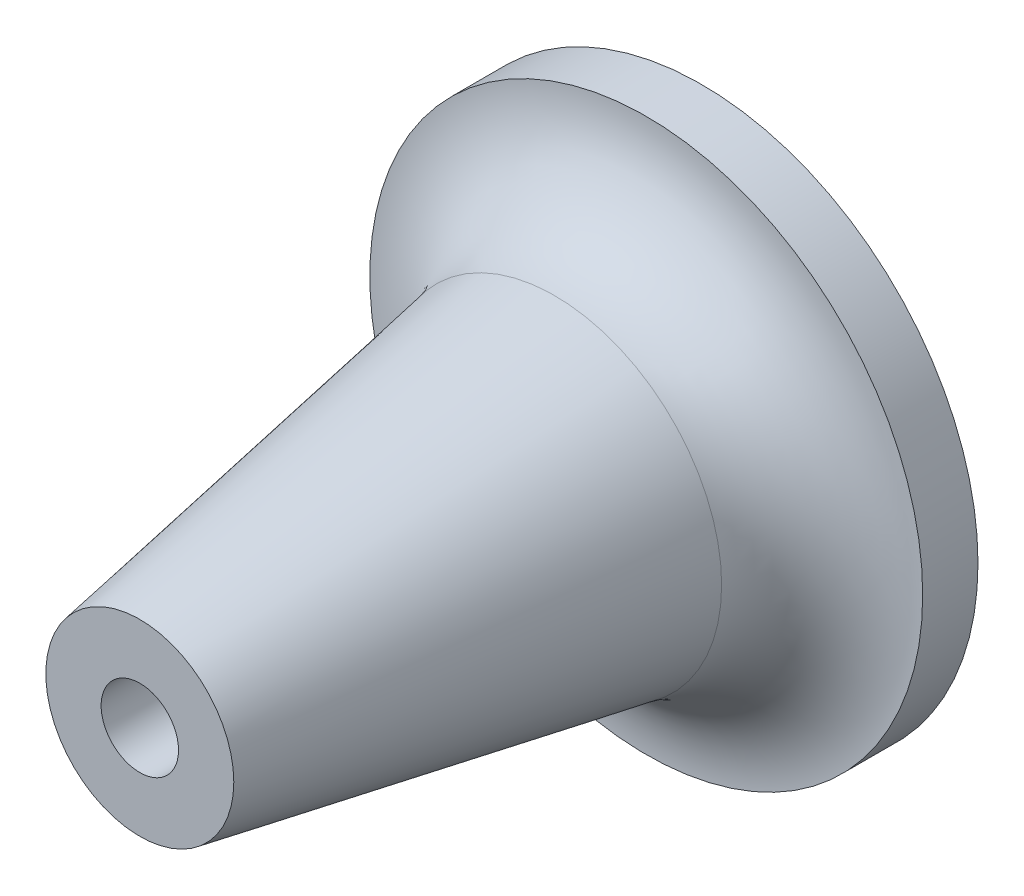
ISO-10303-21;
HEADER;
FILE_DESCRIPTION(('STEP AP214'),'2;1');
FILE_NAME('part.step','',(''),(''),'','','');
FILE_SCHEMA(('AUTOMOTIVE_DESIGN { 1 0 10303 214 1 1 1 1 }'));
ENDSEC;
DATA;
#1=APPLICATION_CONTEXT('core data for automotive mechanical design processes');
#2=APPLICATION_PROTOCOL_DEFINITION('international standard','automotive_design',2000,#1);
#3=PRODUCT_CONTEXT('',#1,'mechanical');
#4=PRODUCT('Part','Part','',(#3));
#5=PRODUCT_RELATED_PRODUCT_CATEGORY('part','',(#4));
#6=PRODUCT_DEFINITION_FORMATION('','',#4);
#7=PRODUCT_DEFINITION_CONTEXT('part definition',#1,'design');
#8=PRODUCT_DEFINITION('design','',#6,#7);
#9=PRODUCT_DEFINITION_SHAPE('','',#8);
#10=(LENGTH_UNIT() NAMED_UNIT(*) SI_UNIT(.MILLI.,.METRE.));
#11=(NAMED_UNIT(*) PLANE_ANGLE_UNIT() SI_UNIT($,.RADIAN.));
#12=(NAMED_UNIT(*) SI_UNIT($,.STERADIAN.) SOLID_ANGLE_UNIT());
#13=UNCERTAINTY_MEASURE_WITH_UNIT(LENGTH_MEASURE(1.E-05),#10,'distance_accuracy_value','');
#14=(GEOMETRIC_REPRESENTATION_CONTEXT(3) GLOBAL_UNCERTAINTY_ASSIGNED_CONTEXT((#13)) GLOBAL_UNIT_ASSIGNED_CONTEXT((#10,
#11,#12)) REPRESENTATION_CONTEXT('',''));
#15=CARTESIAN_POINT('',(0.,0.,0.));
#16=DIRECTION('',(0.,0.,1.));
#17=DIRECTION('',(1.,0.,0.));
#18=AXIS2_PLACEMENT_3D('',#15,#16,#17);
#19=CARTESIAN_POINT('',(0.,8.5,33.7153604632454));
#20=DIRECTION('',(0.,0.,-1.));
#21=DIRECTION('',(-1.,0.,0.));
#22=AXIS2_PLACEMENT_3D('',#19,#20,#21);
#23=PLANE('',#22);
#24=CARTESIAN_POINT('',(0.,0.,33.7153604632454));
#25=DIRECTION('',(0.,0.,1.));
#26=DIRECTION('',(1.,0.,0.));
#27=AXIS2_PLACEMENT_3D('',#24,#25,#26);
#28=CIRCLE('',#27,3.5);
#29=CARTESIAN_POINT('',(3.5,0.,33.7153604632454));
#30=VERTEX_POINT('',#29);
#31=EDGE_CURVE('E10',#30,#30,#28,.T.);
#32=ORIENTED_EDGE('',*,*,#31,.F.);
#33=EDGE_LOOP('',(#32));
#34=FACE_BOUND('',#33,.T.);
#35=CARTESIAN_POINT('',(0.,0.,33.7153604632454));
#36=DIRECTION('',(0.,0.,1.));
#37=DIRECTION('',(1.,0.,0.));
#38=AXIS2_PLACEMENT_3D('',#35,#36,#37);
#39=CIRCLE('',#38,8.5);
#40=CARTESIAN_POINT('',(8.5,0.,33.7153604632454));
#41=VERTEX_POINT('',#40);
#42=EDGE_CURVE('E59',#41,#41,#39,.T.);
#43=ORIENTED_EDGE('',*,*,#42,.T.);
#44=EDGE_LOOP('',(#43));
#45=FACE_BOUND('',#44,.T.);
#46=ADVANCED_FACE('F31',(#34,#45),#23,.F.);
#47=CARTESIAN_POINT('',(0.,0.,51.4954979569622));
#48=DIRECTION('',(0.,0.,1.));
#49=DIRECTION('',(1.,0.,0.));
#50=AXIS2_PLACEMENT_3D('',#47,#48,#49);
#51=CYLINDRICAL_SURFACE('',#50,3.5);
#52=CARTESIAN_POINT('',(0.,0.,28.7153604632454));
#53=DIRECTION('',(0.,0.,1.));
#54=DIRECTION('',(1.,0.,0.));
#55=AXIS2_PLACEMENT_3D('',#52,#53,#54);
#56=CIRCLE('',#55,3.5);
#57=CARTESIAN_POINT('',(-3.5,0.,28.7153604632454));
#58=VERTEX_POINT('',#57);
#59=EDGE_CURVE('E37',#58,#58,#56,.T.);
#60=ORIENTED_EDGE('',*,*,#59,.F.);
#61=EDGE_LOOP('',(#60));
#62=FACE_BOUND('',#61,.T.);
#63=ORIENTED_EDGE('',*,*,#31,.T.);
#64=EDGE_LOOP('',(#63));
#65=FACE_BOUND('',#64,.T.);
#66=ADVANCED_FACE('F96',(#62,#65),#51,.F.);
#67=CARTESIAN_POINT('',(0.,0.,28.7153604632454));
#68=DIRECTION('',(0.,0.,-1.));
#69=DIRECTION('',(-1.,0.,0.));
#70=AXIS2_PLACEMENT_3D('',#67,#68,#69);
#71=CONICAL_SURFACE('',#70,3.5,0.191026219231218);
#72=CARTESIAN_POINT('',(0.,0.,-10.5846395367546));
#73=DIRECTION('',(0.,0.,1.));
#74=DIRECTION('',(1.,0.,0.));
#75=AXIS2_PLACEMENT_3D('',#72,#73,#74);
#76=CIRCLE('',#75,11.1);
#77=CARTESIAN_POINT('',(-11.1,0.,-10.5846395367546));
#78=VERTEX_POINT('',#77);
#79=EDGE_CURVE('E41',#78,#78,#76,.T.);
#80=CARTESIAN_POINT('',(-11.1,0.,-10.5846395367546));
#81=CARTESIAN_POINT('',(-11.0208333333333,0.,-10.1752645367546));
#82=CARTESIAN_POINT('',(-10.9416666666667,0.,-9.76588953675459));
#83=CARTESIAN_POINT('',(-10.7833333333333,0.,-8.94713953675459));
#84=CARTESIAN_POINT('',(-10.7041666666667,0.,-8.53776453675459));
#85=CARTESIAN_POINT('',(-10.5458333333333,0.,-7.71901453675459));
#86=CARTESIAN_POINT('',(-10.4666666666667,0.,-7.30963953675459));
#87=CARTESIAN_POINT('',(-10.3083333333333,0.,-6.49088953675459));
#88=CARTESIAN_POINT('',(-10.2291666666667,0.,-6.08151453675459));
#89=CARTESIAN_POINT('',(-10.0708333333333,0.,-5.26276453675459));
#90=CARTESIAN_POINT('',(-9.99166666666667,0.,-4.85338953675459));
#91=CARTESIAN_POINT('',(-9.83333333333334,0.,-4.03463953675459));
#92=CARTESIAN_POINT('',(-9.75416666666667,0.,-3.62526453675459));
#93=CARTESIAN_POINT('',(-9.59583333333334,0.,-2.80651453675459));
#94=CARTESIAN_POINT('',(-9.51666666666667,0.,-2.39713953675459));
#95=CARTESIAN_POINT('',(-9.35833333333333,0.,-1.57838953675459));
#96=CARTESIAN_POINT('',(-9.27916666666667,0.,-1.16901453675459));
#97=CARTESIAN_POINT('',(-9.12083333333334,0.,-0.350264536754592));
#98=CARTESIAN_POINT('',(-9.04166666666667,0.,0.0591104632454085));
#99=CARTESIAN_POINT('',(-8.88333333333333,0.,0.877860463245408));
#100=CARTESIAN_POINT('',(-8.80416666666667,0.,1.28723546324541));
#101=CARTESIAN_POINT('',(-8.64583333333334,0.,2.10598546324541));
#102=CARTESIAN_POINT('',(-8.56666666666667,0.,2.51536046324541));
#103=CARTESIAN_POINT('',(-8.40833333333333,0.,3.33411046324541));
#104=CARTESIAN_POINT('',(-8.32916666666667,0.,3.74348546324541));
#105=CARTESIAN_POINT('',(-8.17083333333333,0.,4.56223546324541));
#106=CARTESIAN_POINT('',(-8.09166666666667,0.,4.97161046324541));
#107=CARTESIAN_POINT('',(-7.93333333333334,0.,5.79036046324541));
#108=CARTESIAN_POINT('',(-7.85416666666667,0.,6.19973546324541));
#109=CARTESIAN_POINT('',(-7.69583333333333,0.,7.01848546324541));
#110=CARTESIAN_POINT('',(-7.61666666666667,0.,7.42786046324541));
#111=CARTESIAN_POINT('',(-7.45833333333333,0.,8.24661046324541));
#112=CARTESIAN_POINT('',(-7.37916666666667,0.,8.65598546324541));
#113=CARTESIAN_POINT('',(-7.22083333333333,0.,9.47473546324541));
#114=CARTESIAN_POINT('',(-7.14166666666667,0.,9.88411046324541));
#115=CARTESIAN_POINT('',(-6.98333333333333,0.,10.7028604632454));
#116=CARTESIAN_POINT('',(-6.90416666666667,0.,11.1122354632454));
#117=CARTESIAN_POINT('',(-6.74583333333333,0.,11.9309854632454));
#118=CARTESIAN_POINT('',(-6.66666666666667,0.,12.3403604632454));
#119=CARTESIAN_POINT('',(-6.50833333333333,0.,13.1591104632454));
#120=CARTESIAN_POINT('',(-6.42916666666667,0.,13.5684854632454));
#121=CARTESIAN_POINT('',(-6.27083333333333,0.,14.3872354632454));
#122=CARTESIAN_POINT('',(-6.19166666666667,0.,14.7966104632454));
#123=CARTESIAN_POINT('',(-6.03333333333333,0.,15.6153604632454));
#124=CARTESIAN_POINT('',(-5.95416666666667,0.,16.0247354632454));
#125=CARTESIAN_POINT('',(-5.79583333333333,0.,16.8434854632454));
#126=CARTESIAN_POINT('',(-5.71666666666667,0.,17.2528604632454));
#127=CARTESIAN_POINT('',(-5.55833333333333,0.,18.0716104632454));
#128=CARTESIAN_POINT('',(-5.47916666666667,0.,18.4809854632454));
#129=CARTESIAN_POINT('',(-5.32083333333333,0.,19.2997354632454));
#130=CARTESIAN_POINT('',(-5.24166666666667,0.,19.7091104632454));
#131=CARTESIAN_POINT('',(-5.08333333333333,0.,20.5278604632454));
#132=CARTESIAN_POINT('',(-5.00416666666667,0.,20.9372354632454));
#133=CARTESIAN_POINT('',(-4.84583333333333,0.,21.7559854632454));
#134=CARTESIAN_POINT('',(-4.76666666666667,0.,22.1653604632454));
#135=CARTESIAN_POINT('',(-4.60833333333333,0.,22.9841104632454));
#136=CARTESIAN_POINT('',(-4.52916666666667,0.,23.3934854632454));
#137=CARTESIAN_POINT('',(-4.37083333333333,0.,24.2122354632454));
#138=CARTESIAN_POINT('',(-4.29166666666667,0.,24.6216104632454));
#139=CARTESIAN_POINT('',(-4.13333333333333,0.,25.4403604632454));
#140=CARTESIAN_POINT('',(-4.05416666666667,0.,25.8497354632454));
#141=CARTESIAN_POINT('',(-3.89583333333333,0.,26.6684854632454));
#142=CARTESIAN_POINT('',(-3.81666666666667,0.,27.0778604632454));
#143=CARTESIAN_POINT('',(-3.65833333333333,0.,27.8966104632454));
#144=CARTESIAN_POINT('',(-3.57916666666667,0.,28.3059854632454));
#145=CARTESIAN_POINT('',(-3.5,0.,28.7153604632454));
#146=B_SPLINE_CURVE_WITH_KNOTS('',3,(#80,#81,#82,#83,#84,#85,#86,#87,#88,#89,#90,#91,#92,#93,
#94,#95,#96,#97,#98,#99,#100,#101,#102,#103,#104,#105,#106,#107,#108,#109,#110,#111,#112,#113,
#114,#115,#116,#117,#118,#119,#120,#121,#122,#123,#124,#125,#126,#127,#128,#129,#130,#131,#132,
#133,#134,#135,#136,#137,#138,#139,#140,#141,#142,#143,#144,#145),.UNSPECIFIED.,.F.,.F.,(4,2,2,
2,2,2,2,2,2,2,2,2,2,2,2,2,2,2,2,2,2,2,2,2,2,2,2,2,2,2,2,2,4),(0.,1.25087859747659,
2.50175719495318,3.75263579242977,5.00351438990636,6.25439298738295,7.50527158485954,
8.75615018233613,10.0070287798127,11.2579073772893,12.5087859747659,13.7596645722425,
15.0105431697191,16.2614217671957,17.5123003646723,18.7631789621488,20.0140575596254,
21.264936157102,22.5158147545786,23.7666933520552,25.0175719495318,26.2684505470084,
27.519329144485,28.7702077419616,30.0210863394381,31.2719649369147,32.5228435343913,
33.7737221318679,35.0246007293445,36.2754793268211,37.5263579242977,38.7772365217743,
40.0281151192509),.UNSPECIFIED.);
#147=EDGE_CURVE('BSEAM91',#78,#58,#146,.T.);
#148=ORIENTED_EDGE('',*,*,#79,.F.);
#149=ORIENTED_EDGE('',*,*,#59,.T.);
#150=ORIENTED_EDGE('',*,*,#147,.T.);
#151=ORIENTED_EDGE('',*,*,#147,.F.);
#152=EDGE_LOOP('',(#148,#150,#149,#151));
#153=FACE_BOUND('',#152,.T.);
#154=ADVANCED_FACE('F91',(#153),#71,.F.);
#155=CARTESIAN_POINT('',(0.,0.,51.4954979569622));
#156=DIRECTION('',(0.,0.,1.));
#157=DIRECTION('',(1.,0.,0.));
#158=AXIS2_PLACEMENT_3D('',#155,#156,#157);
#159=CYLINDRICAL_SURFACE('',#158,11.1);
#160=CARTESIAN_POINT('',(0.,0.,-17.0846395367546));
#161=DIRECTION('',(0.,0.,1.));
#162=DIRECTION('',(1.,0.,0.));
#163=AXIS2_PLACEMENT_3D('',#160,#161,#162);
#164=CIRCLE('',#163,11.1);
#165=CARTESIAN_POINT('',(11.1,0.,-17.0846395367546));
#166=VERTEX_POINT('',#165);
#167=EDGE_CURVE('E45',#166,#166,#164,.T.);
#168=ORIENTED_EDGE('',*,*,#167,.F.);
#169=EDGE_LOOP('',(#168));
#170=FACE_BOUND('',#169,.T.);
#171=ORIENTED_EDGE('',*,*,#79,.T.);
#172=EDGE_LOOP('',(#171));
#173=FACE_BOUND('',#172,.T.);
#174=ADVANCED_FACE('F85',(#170,#173),#159,.F.);
#175=CARTESIAN_POINT('',(0.,11.1,-17.0846395367546));
#176=DIRECTION('',(0.,0.,1.));
#177=DIRECTION('',(1.,0.,0.));
#178=AXIS2_PLACEMENT_3D('',#175,#176,#177);
#179=PLANE('',#178);
#180=CARTESIAN_POINT('',(0.,0.,-17.0846395367546));
#181=DIRECTION('',(0.,0.,1.));
#182=DIRECTION('',(1.,0.,0.));
#183=AXIS2_PLACEMENT_3D('',#180,#181,#182);
#184=CIRCLE('',#183,25.);
#185=CARTESIAN_POINT('',(25.,0.,-17.0846395367546));
#186=VERTEX_POINT('',#185);
#187=EDGE_CURVE('E50',#186,#186,#184,.T.);
#188=ORIENTED_EDGE('',*,*,#187,.F.);
#189=EDGE_LOOP('',(#188));
#190=FACE_BOUND('',#189,.T.);
#191=ORIENTED_EDGE('',*,*,#167,.T.);
#192=EDGE_LOOP('',(#191));
#193=FACE_BOUND('',#192,.T.);
#194=ADVANCED_FACE('F79',(#190,#193),#179,.F.);
#195=CARTESIAN_POINT('',(0.,0.,51.4954979569622));
#196=DIRECTION('',(0.,0.,1.));
#197=DIRECTION('',(1.,0.,0.));
#198=AXIS2_PLACEMENT_3D('',#195,#196,#197);
#199=CYLINDRICAL_SURFACE('',#198,25.);
#200=CARTESIAN_POINT('',(0.,0.,-12.0846395367546));
#201=DIRECTION('',(0.,0.,1.));
#202=DIRECTION('',(1.,0.,0.));
#203=AXIS2_PLACEMENT_3D('',#200,#201,#202);
#204=CIRCLE('',#203,25.);
#205=CARTESIAN_POINT('',(25.,0.,-12.0846395367546));
#206=VERTEX_POINT('',#205);
#207=EDGE_CURVE('E53',#206,#206,#204,.T.);
#208=ORIENTED_EDGE('',*,*,#207,.F.);
#209=EDGE_LOOP('',(#208));
#210=FACE_BOUND('',#209,.T.);
#211=ORIENTED_EDGE('',*,*,#187,.T.);
#212=EDGE_LOOP('',(#211));
#213=FACE_BOUND('',#212,.T.);
#214=ADVANCED_FACE('F73',(#210,#213),#199,.T.);
#215=CARTESIAN_POINT('',(0.,0.,-2.04503998201178));
#216=DIRECTION('',(0.,0.,1.));
#217=DIRECTION('',(1.,0.,0.));
#218=AXIS2_PLACEMENT_3D('',#215,#216,#217);
#219=TOROIDAL_SURFACE('',#218,25.,10.0395995547428);
#220=CARTESIAN_POINT('',(0.,0.,-3.7883981491986));
#221=DIRECTION('',(0.,0.,1.));
#222=DIRECTION('',(1.,0.,0.));
#223=AXIS2_PLACEMENT_3D('',#220,#221,#222);
#224=CIRCLE('',#223,15.1129245213514);
#225=CARTESIAN_POINT('',(15.1129245213514,0.,-3.7883981491986));
#226=VERTEX_POINT('',#225);
#227=EDGE_CURVE('E56',#226,#226,#224,.T.);
#228=ORIENTED_EDGE('',*,*,#227,.F.);
#229=EDGE_LOOP('',(#228));
#230=FACE_BOUND('',#229,.T.);
#231=ORIENTED_EDGE('',*,*,#207,.T.);
#232=EDGE_LOOP('',(#231));
#233=FACE_BOUND('',#232,.T.);
#234=ADVANCED_FACE('F67',(#230,#233),#219,.F.);
#235=CARTESIAN_POINT('',(0.,0.,-3.7883981491986));
#236=DIRECTION('',(0.,0.,-1.));
#237=DIRECTION('',(-1.,0.,0.));
#238=AXIS2_PLACEMENT_3D('',#235,#236,#237);
#239=CONICAL_SURFACE('',#238,15.1129245213514,0.174532925199434);
#240=ORIENTED_EDGE('',*,*,#42,.F.);
#241=EDGE_LOOP('',(#240));
#242=FACE_BOUND('',#241,.T.);
#243=ORIENTED_EDGE('',*,*,#227,.T.);
#244=EDGE_LOOP('',(#243));
#245=FACE_BOUND('',#244,.T.);
#246=ADVANCED_FACE('F64',(#242,#245),#239,.T.);
#247=CLOSED_SHELL('',(#46,#66,#154,#174,#194,#214,#234,#246));
#248=MANIFOLD_SOLID_BREP('B2',#247);
#249=ADVANCED_BREP_SHAPE_REPRESENTATION('',(#18,#248),#14);
#250=SHAPE_DEFINITION_REPRESENTATION(#9,#249);
ENDSEC;
END-ISO-10303-21;
